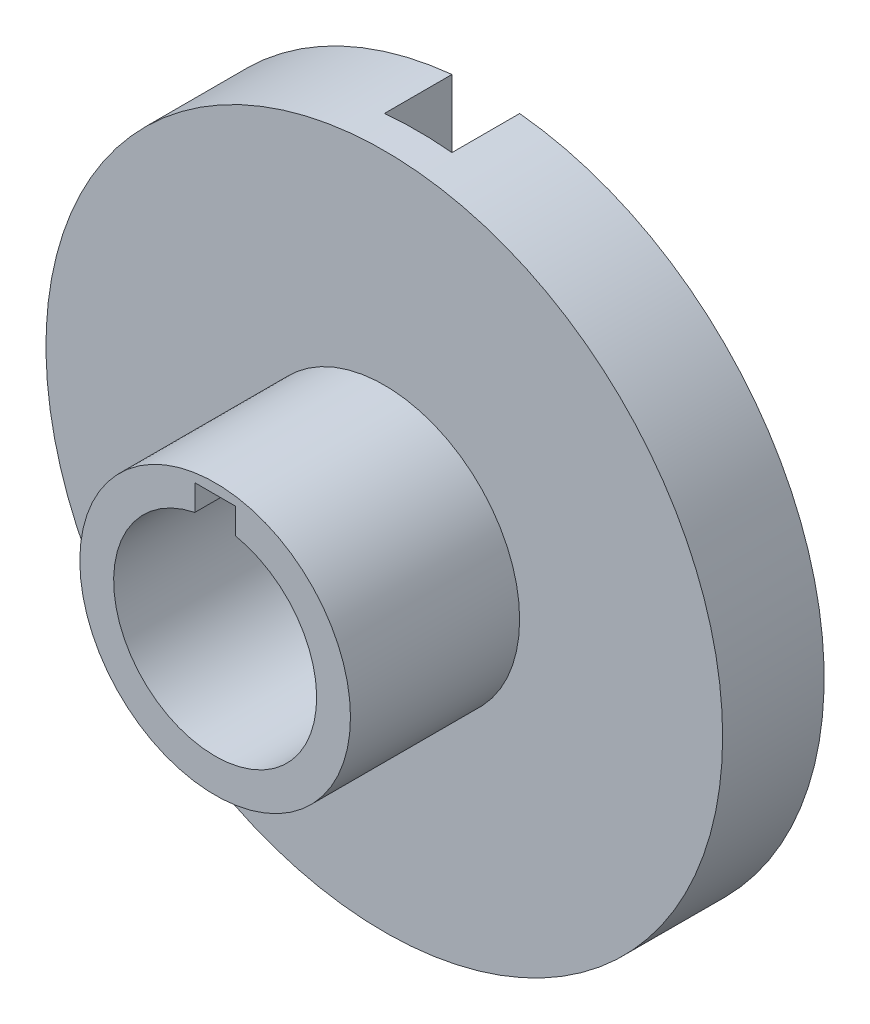
ISO-10303-21;
HEADER;
FILE_DESCRIPTION(('STEP AP214'),'2;1');
FILE_NAME('part.step','',(''),(''),'','','');
FILE_SCHEMA(('AUTOMOTIVE_DESIGN { 1 0 10303 214 1 1 1 1 }'));
ENDSEC;
DATA;
#1=APPLICATION_CONTEXT('core data for automotive mechanical design processes');
#2=APPLICATION_PROTOCOL_DEFINITION('international standard','automotive_design',2000,#1);
#3=PRODUCT_CONTEXT('',#1,'mechanical');
#4=PRODUCT('Part','Part','',(#3));
#5=PRODUCT_RELATED_PRODUCT_CATEGORY('part','',(#4));
#6=PRODUCT_DEFINITION_FORMATION('','',#4);
#7=PRODUCT_DEFINITION_CONTEXT('part definition',#1,'design');
#8=PRODUCT_DEFINITION('design','',#6,#7);
#9=PRODUCT_DEFINITION_SHAPE('','',#8);
#10=(LENGTH_UNIT() NAMED_UNIT(*) SI_UNIT(.MILLI.,.METRE.));
#11=(NAMED_UNIT(*) PLANE_ANGLE_UNIT() SI_UNIT($,.RADIAN.));
#12=(NAMED_UNIT(*) SI_UNIT($,.STERADIAN.) SOLID_ANGLE_UNIT());
#13=UNCERTAINTY_MEASURE_WITH_UNIT(LENGTH_MEASURE(1.E-05),#10,'distance_accuracy_value','');
#14=(GEOMETRIC_REPRESENTATION_CONTEXT(3) GLOBAL_UNCERTAINTY_ASSIGNED_CONTEXT((#13)) GLOBAL_UNIT_ASSIGNED_CONTEXT((#10,
#11,#12)) REPRESENTATION_CONTEXT('',''));
#15=CARTESIAN_POINT('',(0.,0.,0.));
#16=DIRECTION('',(0.,0.,1.));
#17=DIRECTION('',(1.,0.,0.));
#18=AXIS2_PLACEMENT_3D('',#15,#16,#17);
#19=CARTESIAN_POINT('',(0.,0.,0.));
#20=DIRECTION('',(0.,0.,1.));
#21=DIRECTION('',(1.,0.,0.));
#22=AXIS2_PLACEMENT_3D('',#19,#20,#21);
#23=PLANE('',#22);
#24=DIRECTION('',(0.,-1.,0.));
#25=VECTOR('',#24,1.);
#26=CARTESIAN_POINT('',(-5.,80.,0.));
#27=LINE('',#26,#25);
#28=CARTESIAN_POINT('',(-5.,-14.142135623731,0.));
#29=VERTEX_POINT('',#28);
#30=CARTESIAN_POINT('',(-5.,-49.749371855331,0.));
#31=VERTEX_POINT('',#30);
#32=EDGE_CURVE('E192',#29,#31,#27,.T.);
#33=ORIENTED_EDGE('',*,*,#32,.T.);
#34=CARTESIAN_POINT('',(0.,0.,0.));
#35=DIRECTION('',(0.,0.,1.));
#36=DIRECTION('',(1.,0.,0.));
#37=AXIS2_PLACEMENT_3D('',#34,#35,#36);
#38=CIRCLE('',#37,50.);
#39=CARTESIAN_POINT('',(-5.,49.749371855331,0.));
#40=VERTEX_POINT('',#39);
#41=EDGE_CURVE('E155',#40,#31,#38,.T.);
#42=ORIENTED_EDGE('',*,*,#41,.F.);
#43=CARTESIAN_POINT('',(-5.,14.142135623731,0.));
#44=VERTEX_POINT('',#43);
#45=EDGE_CURVE('E203',#40,#44,#27,.T.);
#46=ORIENTED_EDGE('',*,*,#45,.T.);
#47=CARTESIAN_POINT('',(0.,0.,0.));
#48=DIRECTION('',(0.,0.,1.));
#49=DIRECTION('',(1.,0.,0.));
#50=AXIS2_PLACEMENT_3D('',#47,#48,#49);
#51=CIRCLE('',#50,15.);
#52=EDGE_CURVE('E201',#44,#29,#51,.T.);
#53=ORIENTED_EDGE('',*,*,#52,.T.);
#54=EDGE_LOOP('',(#33,#42,#46,#53));
#55=FACE_BOUND('',#54,.T.);
#56=ADVANCED_FACE('F41',(#55),#23,.F.);
#57=DIRECTION('',(0.,-1.,0.));
#58=VECTOR('',#57,1.);
#59=CARTESIAN_POINT('',(5.,80.,0.));
#60=LINE('',#59,#58);
#61=CARTESIAN_POINT('',(5.,49.749371855331,0.));
#62=VERTEX_POINT('',#61);
#63=CARTESIAN_POINT('',(5.,14.142135623731,0.));
#64=VERTEX_POINT('',#63);
#65=EDGE_CURVE('E132',#62,#64,#60,.T.);
#66=ORIENTED_EDGE('',*,*,#65,.F.);
#67=CARTESIAN_POINT('',(5.,-49.749371855331,0.));
#68=VERTEX_POINT('',#67);
#69=EDGE_CURVE('E145',#68,#62,#38,.T.);
#70=ORIENTED_EDGE('',*,*,#69,.F.);
#71=CARTESIAN_POINT('',(5.,-14.142135623731,0.));
#72=VERTEX_POINT('',#71);
#73=EDGE_CURVE('E57',#72,#68,#60,.T.);
#74=ORIENTED_EDGE('',*,*,#73,.F.);
#75=EDGE_CURVE('E147',#72,#64,#51,.T.);
#76=ORIENTED_EDGE('',*,*,#75,.T.);
#77=EDGE_LOOP('',(#66,#70,#74,#76));
#78=FACE_BOUND('',#77,.T.);
#79=ADVANCED_FACE('F144',(#78),#23,.F.);
#80=CARTESIAN_POINT('',(0.,0.,40.));
#81=DIRECTION('',(0.,0.,-1.));
#82=DIRECTION('',(-1.,0.,0.));
#83=AXIS2_PLACEMENT_3D('',#80,#81,#82);
#84=CYLINDRICAL_SURFACE('',#83,15.);
#85=ORIENTED_EDGE('',*,*,#52,.F.);
#86=DIRECTION('',(0.,0.,-1.));
#87=VECTOR('',#86,1.);
#88=CARTESIAN_POINT('',(-5.,14.142135623731,40.));
#89=LINE('',#88,#87);
#90=CARTESIAN_POINT('',(-5.,14.142135623731,10.));
#91=VERTEX_POINT('',#90);
#92=EDGE_CURVE('E241',#44,#91,#89,.F.);
#93=ORIENTED_EDGE('',*,*,#92,.T.);
#94=CARTESIAN_POINT('',(0.,0.,10.));
#95=DIRECTION('',(0.,0.,-1.));
#96=DIRECTION('',(-1.,0.,0.));
#97=AXIS2_PLACEMENT_3D('',#94,#95,#96);
#98=CIRCLE('',#97,15.);
#99=CARTESIAN_POINT('',(-2.99999999999999,14.6969384566991,9.99999999999999));
#100=VERTEX_POINT('',#99);
#101=EDGE_CURVE('E214',#91,#100,#98,.T.);
#102=ORIENTED_EDGE('',*,*,#101,.T.);
#103=DIRECTION('',(0.,0.,-1.));
#104=VECTOR('',#103,1.);
#105=CARTESIAN_POINT('',(-2.99999999999999,14.6969384566991,40.));
#106=LINE('',#105,#104);
#107=CARTESIAN_POINT('',(-2.99999999999999,14.6969384566991,40.));
#108=VERTEX_POINT('',#107);
#109=EDGE_CURVE('E259',#100,#108,#106,.F.);
#110=ORIENTED_EDGE('',*,*,#109,.T.);
#111=CARTESIAN_POINT('',(0.,0.,40.));
#112=DIRECTION('',(0.,0.,1.));
#113=DIRECTION('',(1.,0.,0.));
#114=AXIS2_PLACEMENT_3D('',#111,#112,#113);
#115=CIRCLE('',#114,15.);
#116=CARTESIAN_POINT('',(3.00000000000001,14.6969384566991,40.));
#117=VERTEX_POINT('',#116);
#118=EDGE_CURVE('E163',#108,#117,#115,.T.);
#119=ORIENTED_EDGE('',*,*,#118,.T.);
#120=DIRECTION('',(0.,0.,-1.));
#121=VECTOR('',#120,1.);
#122=CARTESIAN_POINT('',(3.00000000000001,14.6969384566991,40.));
#123=LINE('',#122,#121);
#124=CARTESIAN_POINT('',(3.00000000000001,14.6969384566991,9.99999999999999));
#125=VERTEX_POINT('',#124);
#126=EDGE_CURVE('E255',#117,#125,#123,.T.);
#127=ORIENTED_EDGE('',*,*,#126,.T.);
#128=CARTESIAN_POINT('',(5.,14.142135623731,10.));
#129=VERTEX_POINT('',#128);
#130=EDGE_CURVE('E226',#125,#129,#98,.T.);
#131=ORIENTED_EDGE('',*,*,#130,.T.);
#132=DIRECTION('',(0.,0.,-1.));
#133=VECTOR('',#132,1.);
#134=CARTESIAN_POINT('',(5.,14.142135623731,40.));
#135=LINE('',#134,#133);
#136=EDGE_CURVE('E238',#129,#64,#135,.T.);
#137=ORIENTED_EDGE('',*,*,#136,.T.);
#138=ORIENTED_EDGE('',*,*,#75,.F.);
#139=DIRECTION('',(0.,0.,-1.));
#140=VECTOR('',#139,1.);
#141=CARTESIAN_POINT('',(5.,-14.142135623731,40.));
#142=LINE('',#141,#140);
#143=CARTESIAN_POINT('',(5.,-14.142135623731,10.));
#144=VERTEX_POINT('',#143);
#145=EDGE_CURVE('E234',#72,#144,#142,.F.);
#146=ORIENTED_EDGE('',*,*,#145,.T.);
#147=CARTESIAN_POINT('',(-5.,-14.142135623731,10.));
#148=VERTEX_POINT('',#147);
#149=EDGE_CURVE('E230',#144,#148,#98,.T.);
#150=ORIENTED_EDGE('',*,*,#149,.T.);
#151=DIRECTION('',(0.,0.,-1.));
#152=VECTOR('',#151,1.);
#153=CARTESIAN_POINT('',(-5.,-14.142135623731,40.));
#154=LINE('',#153,#152);
#155=EDGE_CURVE('E244',#148,#29,#154,.T.);
#156=ORIENTED_EDGE('',*,*,#155,.T.);
#157=EDGE_LOOP('',(#85,#93,#102,#110,#119,#127,#131,#137,#138,#146,#150,#156));
#158=FACE_BOUND('',#157,.T.);
#159=ADVANCED_FACE('F278',(#158),#84,.F.);
#160=CARTESIAN_POINT('',(0.,0.,15.));
#161=DIRECTION('',(0.,0.,-1.));
#162=DIRECTION('',(-1.,0.,0.));
#163=AXIS2_PLACEMENT_3D('',#160,#161,#162);
#164=CYLINDRICAL_SURFACE('',#163,50.);
#165=CARTESIAN_POINT('',(0.,0.,15.));
#166=DIRECTION('',(0.,0.,1.));
#167=DIRECTION('',(1.,0.,0.));
#168=AXIS2_PLACEMENT_3D('',#165,#166,#167);
#169=CIRCLE('',#168,50.);
#170=CARTESIAN_POINT('',(50.,0.,15.));
#171=VERTEX_POINT('',#170);
#172=EDGE_CURVE('E167',#171,#171,#169,.T.);
#173=ORIENTED_EDGE('',*,*,#172,.F.);
#174=EDGE_LOOP('',(#173));
#175=FACE_BOUND('',#174,.T.);
#176=DIRECTION('',(0.,0.,-1.));
#177=VECTOR('',#176,1.);
#178=CARTESIAN_POINT('',(-5.,49.749371855331,15.));
#179=LINE('',#178,#177);
#180=CARTESIAN_POINT('',(-5.,49.749371855331,10.));
#181=VERTEX_POINT('',#180);
#182=EDGE_CURVE('E11',#40,#181,#179,.F.);
#183=ORIENTED_EDGE('',*,*,#182,.F.);
#184=ORIENTED_EDGE('',*,*,#41,.T.);
#185=DIRECTION('',(0.,0.,-1.));
#186=VECTOR('',#185,1.);
#187=CARTESIAN_POINT('',(-5.,-49.749371855331,15.));
#188=LINE('',#187,#186);
#189=CARTESIAN_POINT('',(-5.,-49.749371855331,10.));
#190=VERTEX_POINT('',#189);
#191=EDGE_CURVE('E140',#190,#31,#188,.T.);
#192=ORIENTED_EDGE('',*,*,#191,.F.);
#193=CARTESIAN_POINT('',(0.,0.,10.));
#194=DIRECTION('',(0.,0.,-1.));
#195=DIRECTION('',(-1.,0.,0.));
#196=AXIS2_PLACEMENT_3D('',#193,#194,#195);
#197=CIRCLE('',#196,50.);
#198=CARTESIAN_POINT('',(5.,-49.749371855331,10.));
#199=VERTEX_POINT('',#198);
#200=EDGE_CURVE('E231',#199,#190,#197,.T.);
#201=ORIENTED_EDGE('',*,*,#200,.F.);
#202=DIRECTION('',(0.,0.,-1.));
#203=VECTOR('',#202,1.);
#204=CARTESIAN_POINT('',(5.,-49.749371855331,15.));
#205=LINE('',#204,#203);
#206=EDGE_CURVE('E153',#68,#199,#205,.F.);
#207=ORIENTED_EDGE('',*,*,#206,.F.);
#208=ORIENTED_EDGE('',*,*,#69,.T.);
#209=DIRECTION('',(0.,0.,-1.));
#210=VECTOR('',#209,1.);
#211=CARTESIAN_POINT('',(5.,49.749371855331,15.));
#212=LINE('',#211,#210);
#213=CARTESIAN_POINT('',(5.,49.749371855331,10.));
#214=VERTEX_POINT('',#213);
#215=EDGE_CURVE('E50',#214,#62,#212,.T.);
#216=ORIENTED_EDGE('',*,*,#215,.F.);
#217=EDGE_CURVE('E205',#181,#214,#197,.T.);
#218=ORIENTED_EDGE('',*,*,#217,.F.);
#219=EDGE_LOOP('',(#183,#184,#192,#201,#207,#208,#216,#218));
#220=FACE_BOUND('',#219,.T.);
#221=ADVANCED_FACE('F43',(#175,#220),#164,.T.);
#222=CARTESIAN_POINT('',(-2.99999999999999,14.5,80.));
#223=DIRECTION('',(1.,0.,0.));
#224=DIRECTION('',(0.,1.,0.));
#225=AXIS2_PLACEMENT_3D('',#222,#223,#224);
#226=PLANE('',#225);
#227=ORIENTED_EDGE('',*,*,#109,.F.);
#228=DIRECTION('',(0.,1.,0.));
#229=VECTOR('',#228,1.);
#230=CARTESIAN_POINT('',(-2.99999999999999,14.5,9.99999999999999));
#231=LINE('',#230,#229);
#232=CARTESIAN_POINT('',(-2.99999999999999,18.5,9.99999999999999));
#233=VERTEX_POINT('',#232);
#234=EDGE_CURVE('E219',#100,#233,#231,.T.);
#235=ORIENTED_EDGE('',*,*,#234,.T.);
#236=DIRECTION('',(0.,0.,-1.));
#237=VECTOR('',#236,1.);
#238=CARTESIAN_POINT('',(-2.99999999999999,18.5,80.));
#239=LINE('',#238,#237);
#240=CARTESIAN_POINT('',(-2.99999999999999,18.5,40.));
#241=VERTEX_POINT('',#240);
#242=EDGE_CURVE('E247',#241,#233,#239,.T.);
#243=ORIENTED_EDGE('',*,*,#242,.F.);
#244=DIRECTION('',(0.,1.,0.));
#245=VECTOR('',#244,1.);
#246=CARTESIAN_POINT('',(-2.99999999999999,0.,40.));
#247=LINE('',#246,#245);
#248=EDGE_CURVE('E177',#108,#241,#247,.T.);
#249=ORIENTED_EDGE('',*,*,#248,.F.);
#250=EDGE_LOOP('',(#227,#235,#243,#249));
#251=FACE_BOUND('',#250,.T.);
#252=ADVANCED_FACE('F277',(#251),#226,.T.);
#253=CARTESIAN_POINT('',(3.00000000000001,14.5,80.));
#254=DIRECTION('',(-1.,0.,0.));
#255=DIRECTION('',(0.,-1.,0.));
#256=AXIS2_PLACEMENT_3D('',#253,#254,#255);
#257=PLANE('',#256);
#258=DIRECTION('',(0.,0.,-1.));
#259=VECTOR('',#258,1.);
#260=CARTESIAN_POINT('',(3.00000000000001,18.5,80.));
#261=LINE('',#260,#259);
#262=CARTESIAN_POINT('',(3.00000000000001,18.5,40.));
#263=VERTEX_POINT('',#262);
#264=CARTESIAN_POINT('',(3.00000000000001,18.5,9.99999999999999));
#265=VERTEX_POINT('',#264);
#266=EDGE_CURVE('E251',#263,#265,#261,.T.);
#267=ORIENTED_EDGE('',*,*,#266,.T.);
#268=DIRECTION('',(0.,-1.,0.));
#269=VECTOR('',#268,1.);
#270=CARTESIAN_POINT('',(3.00000000000001,14.5,9.99999999999999));
#271=LINE('',#270,#269);
#272=EDGE_CURVE('E65',#265,#125,#271,.T.);
#273=ORIENTED_EDGE('',*,*,#272,.T.);
#274=ORIENTED_EDGE('',*,*,#126,.F.);
#275=DIRECTION('',(0.,-1.,0.));
#276=VECTOR('',#275,1.);
#277=CARTESIAN_POINT('',(3.00000000000001,0.,40.));
#278=LINE('',#277,#276);
#279=EDGE_CURVE('E173',#263,#117,#278,.T.);
#280=ORIENTED_EDGE('',*,*,#279,.F.);
#281=EDGE_LOOP('',(#267,#273,#274,#280));
#282=FACE_BOUND('',#281,.T.);
#283=ADVANCED_FACE('F283',(#282),#257,.T.);
#284=CARTESIAN_POINT('',(-2.99999999999999,18.5,80.));
#285=DIRECTION('',(0.,-1.,0.));
#286=DIRECTION('',(1.,0.,0.));
#287=AXIS2_PLACEMENT_3D('',#284,#285,#286);
#288=PLANE('',#287);
#289=ORIENTED_EDGE('',*,*,#242,.T.);
#290=DIRECTION('',(1.,0.,0.));
#291=VECTOR('',#290,1.);
#292=CARTESIAN_POINT('',(-2.99999999999999,18.5,9.99999999999999));
#293=LINE('',#292,#291);
#294=EDGE_CURVE('E181',#233,#265,#293,.T.);
#295=ORIENTED_EDGE('',*,*,#294,.T.);
#296=ORIENTED_EDGE('',*,*,#266,.F.);
#297=DIRECTION('',(1.,0.,0.));
#298=VECTOR('',#297,1.);
#299=CARTESIAN_POINT('',(0.,18.5,40.));
#300=LINE('',#299,#298);
#301=EDGE_CURVE('E169',#241,#263,#300,.T.);
#302=ORIENTED_EDGE('',*,*,#301,.F.);
#303=EDGE_LOOP('',(#289,#295,#296,#302));
#304=FACE_BOUND('',#303,.T.);
#305=ADVANCED_FACE('F301',(#304),#288,.T.);
#306=CARTESIAN_POINT('',(0.,0.,40.));
#307=DIRECTION('',(0.,0.,1.));
#308=DIRECTION('',(1.,0.,0.));
#309=AXIS2_PLACEMENT_3D('',#306,#307,#308);
#310=PLANE('',#309);
#311=CARTESIAN_POINT('',(0.,0.,40.));
#312=DIRECTION('',(0.,0.,1.));
#313=DIRECTION('',(1.,0.,0.));
#314=AXIS2_PLACEMENT_3D('',#311,#312,#313);
#315=CIRCLE('',#314,20.);
#316=CARTESIAN_POINT('',(20.,0.,40.));
#317=VERTEX_POINT('',#316);
#318=EDGE_CURVE('E156',#317,#317,#315,.T.);
#319=ORIENTED_EDGE('',*,*,#318,.T.);
#320=EDGE_LOOP('',(#319));
#321=FACE_BOUND('',#320,.T.);
#322=ORIENTED_EDGE('',*,*,#118,.F.);
#323=ORIENTED_EDGE('',*,*,#248,.T.);
#324=ORIENTED_EDGE('',*,*,#301,.T.);
#325=ORIENTED_EDGE('',*,*,#279,.T.);
#326=EDGE_LOOP('',(#322,#323,#324,#325));
#327=FACE_BOUND('',#326,.T.);
#328=ADVANCED_FACE('F295',(#321,#327),#310,.T.);
#329=CARTESIAN_POINT('',(0.,0.,15.));
#330=DIRECTION('',(0.,0.,1.));
#331=DIRECTION('',(1.,0.,0.));
#332=AXIS2_PLACEMENT_3D('',#329,#330,#331);
#333=PLANE('',#332);
#334=CARTESIAN_POINT('',(0.,0.,15.));
#335=DIRECTION('',(0.,0.,1.));
#336=DIRECTION('',(1.,0.,0.));
#337=AXIS2_PLACEMENT_3D('',#334,#335,#336);
#338=CIRCLE('',#337,20.);
#339=CARTESIAN_POINT('',(20.,0.,15.));
#340=VERTEX_POINT('',#339);
#341=EDGE_CURVE('E161',#340,#340,#338,.T.);
#342=ORIENTED_EDGE('',*,*,#341,.F.);
#343=EDGE_LOOP('',(#342));
#344=FACE_BOUND('',#343,.T.);
#345=ORIENTED_EDGE('',*,*,#172,.T.);
#346=EDGE_LOOP('',(#345));
#347=FACE_BOUND('',#346,.T.);
#348=ADVANCED_FACE('F274',(#344,#347),#333,.T.);
#349=CARTESIAN_POINT('',(0.,0.,40.));
#350=DIRECTION('',(0.,0.,-1.));
#351=DIRECTION('',(-1.,0.,0.));
#352=AXIS2_PLACEMENT_3D('',#349,#350,#351);
#353=CYLINDRICAL_SURFACE('',#352,20.);
#354=ORIENTED_EDGE('',*,*,#341,.T.);
#355=EDGE_LOOP('',(#354));
#356=FACE_BOUND('',#355,.T.);
#357=ORIENTED_EDGE('',*,*,#318,.F.);
#358=EDGE_LOOP('',(#357));
#359=FACE_BOUND('',#358,.T.);
#360=ADVANCED_FACE('F294',(#356,#359),#353,.T.);
#361=CARTESIAN_POINT('',(-5.,80.,10.));
#362=DIRECTION('',(0.,0.,-1.));
#363=DIRECTION('',(-1.,0.,0.));
#364=AXIS2_PLACEMENT_3D('',#361,#362,#363);
#365=PLANE('',#364);
#366=ORIENTED_EDGE('',*,*,#217,.T.);
#367=DIRECTION('',(0.,-1.,0.));
#368=VECTOR('',#367,1.);
#369=CARTESIAN_POINT('',(5.,80.,10.));
#370=LINE('',#369,#368);
#371=EDGE_CURVE('E135',#214,#129,#370,.T.);
#372=ORIENTED_EDGE('',*,*,#371,.T.);
#373=ORIENTED_EDGE('',*,*,#130,.F.);
#374=ORIENTED_EDGE('',*,*,#272,.F.);
#375=ORIENTED_EDGE('',*,*,#294,.F.);
#376=ORIENTED_EDGE('',*,*,#234,.F.);
#377=ORIENTED_EDGE('',*,*,#101,.F.);
#378=DIRECTION('',(0.,-1.,0.));
#379=VECTOR('',#378,1.);
#380=CARTESIAN_POINT('',(-5.,80.,10.));
#381=LINE('',#380,#379);
#382=EDGE_CURVE('E210',#181,#91,#381,.T.);
#383=ORIENTED_EDGE('',*,*,#382,.F.);
#384=EDGE_LOOP('',(#366,#372,#373,#374,#375,#376,#377,#383));
#385=FACE_BOUND('',#384,.T.);
#386=ADVANCED_FACE('F212',(#385),#365,.T.);
#387=CARTESIAN_POINT('',(5.,80.,10.));
#388=DIRECTION('',(-1.,0.,0.));
#389=DIRECTION('',(0.,0.,1.));
#390=AXIS2_PLACEMENT_3D('',#387,#388,#389);
#391=PLANE('',#390);
#392=ORIENTED_EDGE('',*,*,#371,.F.);
#393=ORIENTED_EDGE('',*,*,#215,.T.);
#394=ORIENTED_EDGE('',*,*,#65,.T.);
#395=ORIENTED_EDGE('',*,*,#136,.F.);
#396=EDGE_LOOP('',(#392,#393,#394,#395));
#397=FACE_BOUND('',#396,.T.);
#398=ADVANCED_FACE('F131',(#397),#391,.T.);
#399=CARTESIAN_POINT('',(-5.,80.,10.));
#400=DIRECTION('',(1.,0.,0.));
#401=DIRECTION('',(0.,0.,-1.));
#402=AXIS2_PLACEMENT_3D('',#399,#400,#401);
#403=PLANE('',#402);
#404=ORIENTED_EDGE('',*,*,#45,.F.);
#405=ORIENTED_EDGE('',*,*,#182,.T.);
#406=ORIENTED_EDGE('',*,*,#382,.T.);
#407=ORIENTED_EDGE('',*,*,#92,.F.);
#408=EDGE_LOOP('',(#404,#405,#406,#407));
#409=FACE_BOUND('',#408,.T.);
#410=ADVANCED_FACE('F209',(#409),#403,.T.);
#411=EDGE_CURVE('E195',#148,#190,#381,.T.);
#412=ORIENTED_EDGE('',*,*,#411,.T.);
#413=ORIENTED_EDGE('',*,*,#191,.T.);
#414=ORIENTED_EDGE('',*,*,#32,.F.);
#415=ORIENTED_EDGE('',*,*,#155,.F.);
#416=EDGE_LOOP('',(#412,#413,#414,#415));
#417=FACE_BOUND('',#416,.T.);
#418=ADVANCED_FACE('F191',(#417),#403,.T.);
#419=ORIENTED_EDGE('',*,*,#73,.T.);
#420=ORIENTED_EDGE('',*,*,#206,.T.);
#421=EDGE_CURVE('E149',#144,#199,#370,.T.);
#422=ORIENTED_EDGE('',*,*,#421,.F.);
#423=ORIENTED_EDGE('',*,*,#145,.F.);
#424=EDGE_LOOP('',(#419,#420,#422,#423));
#425=FACE_BOUND('',#424,.T.);
#426=ADVANCED_FACE('F312',(#425),#391,.T.);
#427=ORIENTED_EDGE('',*,*,#421,.T.);
#428=ORIENTED_EDGE('',*,*,#200,.T.);
#429=ORIENTED_EDGE('',*,*,#411,.F.);
#430=ORIENTED_EDGE('',*,*,#149,.F.);
#431=EDGE_LOOP('',(#427,#428,#429,#430));
#432=FACE_BOUND('',#431,.T.);
#433=ADVANCED_FACE('F315',(#432),#365,.T.);
#434=CLOSED_SHELL('',(#56,#79,#159,#221,#252,#283,#305,#328,#348,#360,#386,#398,#410,#418,#426,#433));
#435=MANIFOLD_SOLID_BREP('B2',#434);
#436=ADVANCED_BREP_SHAPE_REPRESENTATION('',(#18,#435),#14);
#437=SHAPE_DEFINITION_REPRESENTATION(#9,#436);
ENDSEC;
END-ISO-10303-21;
